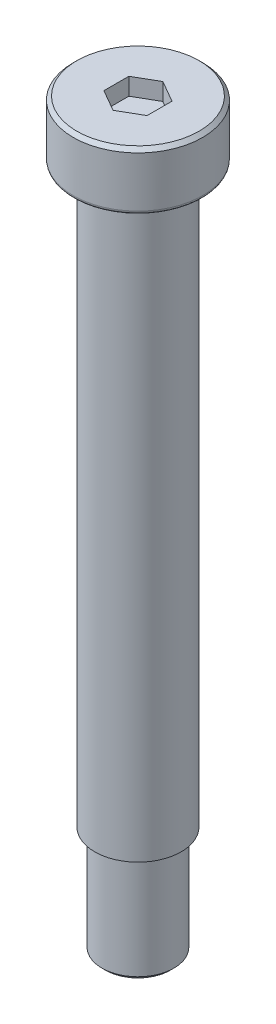
ISO-10303-21;
HEADER;
FILE_DESCRIPTION(('STEP AP214'),'2;1');
FILE_NAME('part.step','',(''),(''),'','','');
FILE_SCHEMA(('AUTOMOTIVE_DESIGN { 1 0 10303 214 1 1 1 1 }'));
ENDSEC;
DATA;
#1=APPLICATION_CONTEXT('core data for automotive mechanical design processes');
#2=APPLICATION_PROTOCOL_DEFINITION('international standard','automotive_design',2000,#1);
#3=PRODUCT_CONTEXT('',#1,'mechanical');
#4=PRODUCT('Part','Part','',(#3));
#5=PRODUCT_RELATED_PRODUCT_CATEGORY('part','',(#4));
#6=PRODUCT_DEFINITION_FORMATION('','',#4);
#7=PRODUCT_DEFINITION_CONTEXT('part definition',#1,'design');
#8=PRODUCT_DEFINITION('design','',#6,#7);
#9=PRODUCT_DEFINITION_SHAPE('','',#8);
#10=(LENGTH_UNIT() NAMED_UNIT(*) SI_UNIT(.MILLI.,.METRE.));
#11=(NAMED_UNIT(*) PLANE_ANGLE_UNIT() SI_UNIT($,.RADIAN.));
#12=(NAMED_UNIT(*) SI_UNIT($,.STERADIAN.) SOLID_ANGLE_UNIT());
#13=UNCERTAINTY_MEASURE_WITH_UNIT(LENGTH_MEASURE(1.E-05),#10,'distance_accuracy_value','');
#14=(GEOMETRIC_REPRESENTATION_CONTEXT(3) GLOBAL_UNCERTAINTY_ASSIGNED_CONTEXT((#13)) GLOBAL_UNIT_ASSIGNED_CONTEXT((#10,
#11,#12)) REPRESENTATION_CONTEXT('',''));
#15=CARTESIAN_POINT('',(0.,0.,0.));
#16=DIRECTION('',(0.,0.,1.));
#17=DIRECTION('',(1.,0.,0.));
#18=AXIS2_PLACEMENT_3D('',#15,#16,#17);
#19=CARTESIAN_POINT('',(0.,0.,0.));
#20=DIRECTION('',(0.,-1.,0.));
#21=DIRECTION('',(1.,0.,0.));
#22=AXIS2_PLACEMENT_3D('',#19,#20,#21);
#23=PLANE('',#22);
#24=CARTESIAN_POINT('',(0.,0.,0.));
#25=DIRECTION('',(0.,-1.,0.));
#26=DIRECTION('',(1.,0.,0.));
#27=AXIS2_PLACEMENT_3D('',#24,#25,#26);
#28=CIRCLE('',#27,8.49999999999999);
#29=CARTESIAN_POINT('',(8.49999999999999,0.,0.));
#30=VERTEX_POINT('',#29);
#31=EDGE_CURVE('E164',#30,#30,#28,.F.);
#32=ORIENTED_EDGE('',*,*,#31,.T.);
#33=EDGE_LOOP('',(#32));
#34=FACE_BOUND('',#33,.T.);
#35=DIRECTION('',(0.866025403784439,0.,-0.5));
#36=VECTOR('',#35,1.);
#37=CARTESIAN_POINT('',(0.,0.,3.46410161513776));
#38=LINE('',#37,#36);
#39=CARTESIAN_POINT('',(0.,0.,3.46410161513776));
#40=VERTEX_POINT('',#39);
#41=CARTESIAN_POINT('',(3.,0.,1.73205080756888));
#42=VERTEX_POINT('',#41);
#43=EDGE_CURVE('E131',#40,#42,#38,.T.);
#44=ORIENTED_EDGE('',*,*,#43,.F.);
#45=DIRECTION('',(0.866025403784439,0.,0.5));
#46=VECTOR('',#45,1.);
#47=CARTESIAN_POINT('',(-3.,0.,1.73205080756888));
#48=LINE('',#47,#46);
#49=CARTESIAN_POINT('',(-3.,0.,1.73205080756888));
#50=VERTEX_POINT('',#49);
#51=EDGE_CURVE('E57',#50,#40,#48,.T.);
#52=ORIENTED_EDGE('',*,*,#51,.F.);
#53=DIRECTION('',(0.,0.,1.));
#54=VECTOR('',#53,1.);
#55=CARTESIAN_POINT('',(-3.,0.,-1.73205080756888));
#56=LINE('',#55,#54);
#57=CARTESIAN_POINT('',(-3.,0.,-1.73205080756888));
#58=VERTEX_POINT('',#57);
#59=EDGE_CURVE('E140',#58,#50,#56,.T.);
#60=ORIENTED_EDGE('',*,*,#59,.F.);
#61=DIRECTION('',(-0.866025403784439,0.,0.5));
#62=VECTOR('',#61,1.);
#63=CARTESIAN_POINT('',(0.,0.,-3.46410161513775));
#64=LINE('',#63,#62);
#65=CARTESIAN_POINT('',(0.,0.,-3.46410161513775));
#66=VERTEX_POINT('',#65);
#67=EDGE_CURVE('E138',#66,#58,#64,.T.);
#68=ORIENTED_EDGE('',*,*,#67,.F.);
#69=DIRECTION('',(-0.866025403784439,0.,-0.5));
#70=VECTOR('',#69,1.);
#71=CARTESIAN_POINT('',(3.,0.,-1.73205080756888));
#72=LINE('',#71,#70);
#73=CARTESIAN_POINT('',(3.,0.,-1.73205080756888));
#74=VERTEX_POINT('',#73);
#75=EDGE_CURVE('E105',#74,#66,#72,.T.);
#76=ORIENTED_EDGE('',*,*,#75,.F.);
#77=DIRECTION('',(0.,0.,-1.));
#78=VECTOR('',#77,1.);
#79=CARTESIAN_POINT('',(3.,0.,1.73205080756888));
#80=LINE('',#79,#78);
#81=EDGE_CURVE('E134',#42,#74,#80,.T.);
#82=ORIENTED_EDGE('',*,*,#81,.F.);
#83=EDGE_LOOP('',(#44,#52,#60,#68,#76,#82));
#84=FACE_BOUND('',#83,.T.);
#85=ADVANCED_FACE('F41',(#34,#84),#23,.F.);
#86=CARTESIAN_POINT('',(0.,5.,0.));
#87=DIRECTION('',(0.,1.,0.));
#88=DIRECTION('',(-1.,0.,0.));
#89=AXIS2_PLACEMENT_3D('',#86,#87,#88);
#90=CYLINDRICAL_SURFACE('',#89,9.);
#91=CARTESIAN_POINT('',(0.,-7.50000000000001,0.));
#92=DIRECTION('',(0.,1.,0.));
#93=DIRECTION('',(-1.,0.,0.));
#94=AXIS2_PLACEMENT_3D('',#91,#92,#93);
#95=CIRCLE('',#94,9.);
#96=CARTESIAN_POINT('',(-9.,-7.50000000000001,0.));
#97=VERTEX_POINT('',#96);
#98=EDGE_CURVE('E170',#97,#97,#95,.T.);
#99=ORIENTED_EDGE('',*,*,#98,.T.);
#100=EDGE_LOOP('',(#99));
#101=FACE_BOUND('',#100,.T.);
#102=CARTESIAN_POINT('',(0.,-0.499999999999996,0.));
#103=DIRECTION('',(0.,-1.,0.));
#104=DIRECTION('',(1.,0.,0.));
#105=AXIS2_PLACEMENT_3D('',#102,#103,#104);
#106=CIRCLE('',#105,9.);
#107=CARTESIAN_POINT('',(9.,-0.499999999999995,0.));
#108=VERTEX_POINT('',#107);
#109=EDGE_CURVE('E167',#108,#108,#106,.T.);
#110=ORIENTED_EDGE('',*,*,#109,.T.);
#111=EDGE_LOOP('',(#110));
#112=FACE_BOUND('',#111,.T.);
#113=ADVANCED_FACE('F192',(#101,#112),#90,.T.);
#114=CARTESIAN_POINT('',(9.,-8.,0.));
#115=DIRECTION('',(0.,1.,0.));
#116=DIRECTION('',(-1.,0.,0.));
#117=AXIS2_PLACEMENT_3D('',#114,#115,#116);
#118=PLANE('',#117);
#119=CARTESIAN_POINT('',(0.,-8.00000000000001,0.));
#120=DIRECTION('',(0.,1.,0.));
#121=DIRECTION('',(-1.,0.,0.));
#122=AXIS2_PLACEMENT_3D('',#119,#120,#121);
#123=CIRCLE('',#122,8.5);
#124=CARTESIAN_POINT('',(-8.49999999999999,-8.00000000000001,0.));
#125=VERTEX_POINT('',#124);
#126=EDGE_CURVE('E173',#125,#125,#123,.F.);
#127=ORIENTED_EDGE('',*,*,#126,.T.);
#128=EDGE_LOOP('',(#127));
#129=FACE_BOUND('',#128,.T.);
#130=CARTESIAN_POINT('',(0.,-8.,0.));
#131=DIRECTION('',(0.,1.,0.));
#132=DIRECTION('',(-1.,0.,0.));
#133=AXIS2_PLACEMENT_3D('',#130,#131,#132);
#134=CIRCLE('',#133,5.75);
#135=CARTESIAN_POINT('',(-5.75,-8.,0.));
#136=VERTEX_POINT('',#135);
#137=EDGE_CURVE('E161',#136,#136,#134,.T.);
#138=ORIENTED_EDGE('',*,*,#137,.T.);
#139=EDGE_LOOP('',(#138));
#140=FACE_BOUND('',#139,.T.);
#141=ADVANCED_FACE('F200',(#129,#140),#118,.F.);
#142=CARTESIAN_POINT('',(0.,5.,0.));
#143=DIRECTION('',(0.,1.,0.));
#144=DIRECTION('',(-1.,0.,0.));
#145=AXIS2_PLACEMENT_3D('',#142,#143,#144);
#146=CYLINDRICAL_SURFACE('',#145,5.75);
#147=ORIENTED_EDGE('',*,*,#137,.F.);
#148=EDGE_LOOP('',(#147));
#149=FACE_BOUND('',#148,.T.);
#150=CARTESIAN_POINT('',(0.,-8.5,0.));
#151=DIRECTION('',(0.,1.,0.));
#152=DIRECTION('',(-1.,0.,0.));
#153=AXIS2_PLACEMENT_3D('',#150,#151,#152);
#154=CIRCLE('',#153,5.75);
#155=CARTESIAN_POINT('',(-5.75,-8.5,0.));
#156=VERTEX_POINT('',#155);
#157=EDGE_CURVE('E158',#156,#156,#154,.T.);
#158=ORIENTED_EDGE('',*,*,#157,.T.);
#159=EDGE_LOOP('',(#158));
#160=FACE_BOUND('',#159,.T.);
#161=ADVANCED_FACE('F254',(#149,#160),#146,.T.);
#162=CARTESIAN_POINT('',(5.75,-8.5,0.));
#163=DIRECTION('',(0.,-1.,0.));
#164=DIRECTION('',(1.,0.,0.));
#165=AXIS2_PLACEMENT_3D('',#162,#163,#164);
#166=PLANE('',#165);
#167=ORIENTED_EDGE('',*,*,#157,.F.);
#168=EDGE_LOOP('',(#167));
#169=FACE_BOUND('',#168,.T.);
#170=CARTESIAN_POINT('',(0.,-8.5,0.));
#171=DIRECTION('',(0.,1.,0.));
#172=DIRECTION('',(-1.,0.,0.));
#173=AXIS2_PLACEMENT_3D('',#170,#171,#172);
#174=CIRCLE('',#173,6.);
#175=CARTESIAN_POINT('',(-6.,-8.5,0.));
#176=VERTEX_POINT('',#175);
#177=EDGE_CURVE('E155',#176,#176,#174,.T.);
#178=ORIENTED_EDGE('',*,*,#177,.T.);
#179=EDGE_LOOP('',(#178));
#180=FACE_BOUND('',#179,.T.);
#181=ADVANCED_FACE('F250',(#169,#180),#166,.F.);
#182=CARTESIAN_POINT('',(0.,5.,0.));
#183=DIRECTION('',(0.,1.,0.));
#184=DIRECTION('',(-1.,0.,0.));
#185=AXIS2_PLACEMENT_3D('',#182,#183,#184);
#186=CYLINDRICAL_SURFACE('',#185,6.00000000000001);
#187=ORIENTED_EDGE('',*,*,#177,.F.);
#188=EDGE_LOOP('',(#187));
#189=FACE_BOUND('',#188,.T.);
#190=CARTESIAN_POINT('',(0.,-88.,0.));
#191=DIRECTION('',(0.,1.,0.));
#192=DIRECTION('',(-1.,0.,0.));
#193=AXIS2_PLACEMENT_3D('',#190,#191,#192);
#194=CIRCLE('',#193,6.00000000000001);
#195=CARTESIAN_POINT('',(-6.,-88.,0.));
#196=VERTEX_POINT('',#195);
#197=EDGE_CURVE('E152',#196,#196,#194,.T.);
#198=ORIENTED_EDGE('',*,*,#197,.T.);
#199=EDGE_LOOP('',(#198));
#200=FACE_BOUND('',#199,.T.);
#201=ADVANCED_FACE('F246',(#189,#200),#186,.T.);
#202=CARTESIAN_POINT('',(6.00000000000002,-88.,0.));
#203=DIRECTION('',(0.,1.,0.));
#204=DIRECTION('',(-1.,0.,0.));
#205=AXIS2_PLACEMENT_3D('',#202,#203,#204);
#206=PLANE('',#205);
#207=ORIENTED_EDGE('',*,*,#197,.F.);
#208=EDGE_LOOP('',(#207));
#209=FACE_BOUND('',#208,.T.);
#210=CARTESIAN_POINT('',(0.,-88.,0.));
#211=DIRECTION('',(0.,1.,0.));
#212=DIRECTION('',(-1.,0.,0.));
#213=AXIS2_PLACEMENT_3D('',#210,#211,#212);
#214=CIRCLE('',#213,5.);
#215=CARTESIAN_POINT('',(-4.99999999999999,-88.,0.));
#216=VERTEX_POINT('',#215);
#217=EDGE_CURVE('E144',#216,#216,#214,.T.);
#218=ORIENTED_EDGE('',*,*,#217,.T.);
#219=EDGE_LOOP('',(#218));
#220=FACE_BOUND('',#219,.T.);
#221=ADVANCED_FACE('F243',(#209,#220),#206,.F.);
#222=CARTESIAN_POINT('',(0.,5.,0.));
#223=DIRECTION('',(0.,1.,0.));
#224=DIRECTION('',(-1.,0.,0.));
#225=AXIS2_PLACEMENT_3D('',#222,#223,#224);
#226=CYLINDRICAL_SURFACE('',#225,5.);
#227=CARTESIAN_POINT('',(0.,-102.5,0.));
#228=DIRECTION('',(0.,1.,0.));
#229=DIRECTION('',(-1.,0.,0.));
#230=AXIS2_PLACEMENT_3D('',#227,#228,#229);
#231=CIRCLE('',#230,5.);
#232=CARTESIAN_POINT('',(-4.99999999999999,-102.5,0.));
#233=VERTEX_POINT('',#232);
#234=EDGE_CURVE('E50',#233,#233,#231,.T.);
#235=ORIENTED_EDGE('',*,*,#234,.T.);
#236=EDGE_LOOP('',(#235));
#237=FACE_BOUND('',#236,.T.);
#238=ORIENTED_EDGE('',*,*,#217,.F.);
#239=EDGE_LOOP('',(#238));
#240=FACE_BOUND('',#239,.T.);
#241=ADVANCED_FACE('F178',(#237,#240),#226,.T.);
#242=CARTESIAN_POINT('',(5.00000000000001,-103.,0.));
#243=DIRECTION('',(0.,1.,0.));
#244=DIRECTION('',(-1.,0.,0.));
#245=AXIS2_PLACEMENT_3D('',#242,#243,#244);
#246=PLANE('',#245);
#247=CARTESIAN_POINT('',(0.,-103.,0.));
#248=DIRECTION('',(0.,1.,0.));
#249=DIRECTION('',(-1.,0.,0.));
#250=AXIS2_PLACEMENT_3D('',#247,#248,#249);
#251=CIRCLE('',#250,4.49999999999997);
#252=CARTESIAN_POINT('',(-4.49999999999996,-103.,0.));
#253=VERTEX_POINT('',#252);
#254=EDGE_CURVE('E11',#253,#253,#251,.F.);
#255=ORIENTED_EDGE('',*,*,#254,.T.);
#256=EDGE_LOOP('',(#255));
#257=FACE_BOUND('',#256,.T.);
#258=ADVANCED_FACE('F238',(#257),#246,.F.);
#259=CARTESIAN_POINT('',(-3.,-2.4,1.73205080756888));
#260=DIRECTION('',(-0.5,0.,0.866025403784439));
#261=DIRECTION('',(0.866025403784439,0.,0.5));
#262=AXIS2_PLACEMENT_3D('',#259,#260,#261);
#263=PLANE('',#262);
#264=ORIENTED_EDGE('',*,*,#51,.T.);
#265=DIRECTION('',(0.,1.,0.));
#266=VECTOR('',#265,1.);
#267=CARTESIAN_POINT('',(0.,-2.4,3.46410161513776));
#268=LINE('',#267,#266);
#269=CARTESIAN_POINT('',(0.,-2.4,3.46410161513776));
#270=VERTEX_POINT('',#269);
#271=EDGE_CURVE('E87',#270,#40,#268,.T.);
#272=ORIENTED_EDGE('',*,*,#271,.F.);
#273=DIRECTION('',(0.866025403784439,0.,0.5));
#274=VECTOR('',#273,1.);
#275=CARTESIAN_POINT('',(-3.,-2.4,1.73205080756888));
#276=LINE('',#275,#274);
#277=CARTESIAN_POINT('',(-3.,-2.4,1.73205080756888));
#278=VERTEX_POINT('',#277);
#279=EDGE_CURVE('E142',#278,#270,#276,.T.);
#280=ORIENTED_EDGE('',*,*,#279,.F.);
#281=DIRECTION('',(0.,1.,0.));
#282=VECTOR('',#281,1.);
#283=CARTESIAN_POINT('',(-3.,-2.4,1.73205080756888));
#284=LINE('',#283,#282);
#285=EDGE_CURVE('E65',#278,#50,#284,.T.);
#286=ORIENTED_EDGE('',*,*,#285,.T.);
#287=EDGE_LOOP('',(#264,#272,#280,#286));
#288=FACE_BOUND('',#287,.T.);
#289=ADVANCED_FACE('F228',(#288),#263,.F.);
#290=CARTESIAN_POINT('',(-3.,-2.4,-1.73205080756888));
#291=DIRECTION('',(-1.,0.,0.));
#292=DIRECTION('',(0.,-1.,0.));
#293=AXIS2_PLACEMENT_3D('',#290,#291,#292);
#294=PLANE('',#293);
#295=ORIENTED_EDGE('',*,*,#59,.T.);
#296=ORIENTED_EDGE('',*,*,#285,.F.);
#297=DIRECTION('',(0.,0.,1.));
#298=VECTOR('',#297,1.);
#299=CARTESIAN_POINT('',(-3.,-2.4,-1.73205080756888));
#300=LINE('',#299,#298);
#301=CARTESIAN_POINT('',(-3.,-2.4,-1.73205080756888));
#302=VERTEX_POINT('',#301);
#303=EDGE_CURVE('E117',#302,#278,#300,.T.);
#304=ORIENTED_EDGE('',*,*,#303,.F.);
#305=DIRECTION('',(0.,1.,0.));
#306=VECTOR('',#305,1.);
#307=CARTESIAN_POINT('',(-3.,-2.4,-1.73205080756888));
#308=LINE('',#307,#306);
#309=EDGE_CURVE('E109',#302,#58,#308,.T.);
#310=ORIENTED_EDGE('',*,*,#309,.T.);
#311=EDGE_LOOP('',(#295,#296,#304,#310));
#312=FACE_BOUND('',#311,.T.);
#313=ADVANCED_FACE('F225',(#312),#294,.F.);
#314=CARTESIAN_POINT('',(0.,-2.4,-3.46410161513775));
#315=DIRECTION('',(-0.5,0.,-0.866025403784439));
#316=DIRECTION('',(-0.866025403784439,0.,0.5));
#317=AXIS2_PLACEMENT_3D('',#314,#315,#316);
#318=PLANE('',#317);
#319=ORIENTED_EDGE('',*,*,#67,.T.);
#320=ORIENTED_EDGE('',*,*,#309,.F.);
#321=DIRECTION('',(-0.866025403784439,0.,0.5));
#322=VECTOR('',#321,1.);
#323=CARTESIAN_POINT('',(0.,-2.4,-3.46410161513775));
#324=LINE('',#323,#322);
#325=CARTESIAN_POINT('',(0.,-2.4,-3.46410161513775));
#326=VERTEX_POINT('',#325);
#327=EDGE_CURVE('E113',#326,#302,#324,.T.);
#328=ORIENTED_EDGE('',*,*,#327,.F.);
#329=DIRECTION('',(0.,1.,0.));
#330=VECTOR('',#329,1.);
#331=CARTESIAN_POINT('',(0.,-2.4,-3.46410161513775));
#332=LINE('',#331,#330);
#333=EDGE_CURVE('E98',#326,#66,#332,.T.);
#334=ORIENTED_EDGE('',*,*,#333,.T.);
#335=EDGE_LOOP('',(#319,#320,#328,#334));
#336=FACE_BOUND('',#335,.T.);
#337=ADVANCED_FACE('F114',(#336),#318,.F.);
#338=CARTESIAN_POINT('',(3.,-2.4,-1.73205080756888));
#339=DIRECTION('',(0.5,0.,-0.866025403784439));
#340=DIRECTION('',(-0.866025403784439,0.,-0.5));
#341=AXIS2_PLACEMENT_3D('',#338,#339,#340);
#342=PLANE('',#341);
#343=ORIENTED_EDGE('',*,*,#75,.T.);
#344=ORIENTED_EDGE('',*,*,#333,.F.);
#345=DIRECTION('',(-0.866025403784439,0.,-0.5));
#346=VECTOR('',#345,1.);
#347=CARTESIAN_POINT('',(3.,-2.4,-1.73205080756888));
#348=LINE('',#347,#346);
#349=CARTESIAN_POINT('',(3.,-2.4,-1.73205080756888));
#350=VERTEX_POINT('',#349);
#351=EDGE_CURVE('E102',#350,#326,#348,.T.);
#352=ORIENTED_EDGE('',*,*,#351,.F.);
#353=DIRECTION('',(0.,1.,0.));
#354=VECTOR('',#353,1.);
#355=CARTESIAN_POINT('',(3.,-2.4,-1.73205080756888));
#356=LINE('',#355,#354);
#357=EDGE_CURVE('E110',#350,#74,#356,.T.);
#358=ORIENTED_EDGE('',*,*,#357,.T.);
#359=EDGE_LOOP('',(#343,#344,#352,#358));
#360=FACE_BOUND('',#359,.T.);
#361=ADVANCED_FACE('F100',(#360),#342,.F.);
#362=CARTESIAN_POINT('',(3.,-2.4,1.73205080756888));
#363=DIRECTION('',(1.,0.,0.));
#364=DIRECTION('',(0.,0.,-1.));
#365=AXIS2_PLACEMENT_3D('',#362,#363,#364);
#366=PLANE('',#365);
#367=ORIENTED_EDGE('',*,*,#81,.T.);
#368=ORIENTED_EDGE('',*,*,#357,.F.);
#369=DIRECTION('',(0.,0.,-1.));
#370=VECTOR('',#369,1.);
#371=CARTESIAN_POINT('',(3.,-2.4,1.73205080756888));
#372=LINE('',#371,#370);
#373=CARTESIAN_POINT('',(3.,-2.4,1.73205080756888));
#374=VERTEX_POINT('',#373);
#375=EDGE_CURVE('E123',#374,#350,#372,.T.);
#376=ORIENTED_EDGE('',*,*,#375,.F.);
#377=DIRECTION('',(0.,1.,0.));
#378=VECTOR('',#377,1.);
#379=CARTESIAN_POINT('',(3.,-2.4,1.73205080756888));
#380=LINE('',#379,#378);
#381=EDGE_CURVE('E147',#374,#42,#380,.T.);
#382=ORIENTED_EDGE('',*,*,#381,.T.);
#383=EDGE_LOOP('',(#367,#368,#376,#382));
#384=FACE_BOUND('',#383,.T.);
#385=ADVANCED_FACE('F221',(#384),#366,.F.);
#386=CARTESIAN_POINT('',(0.,-2.4,3.46410161513776));
#387=DIRECTION('',(0.5,0.,0.866025403784439));
#388=DIRECTION('',(0.866025403784439,0.,-0.5));
#389=AXIS2_PLACEMENT_3D('',#386,#387,#388);
#390=PLANE('',#389);
#391=ORIENTED_EDGE('',*,*,#43,.T.);
#392=ORIENTED_EDGE('',*,*,#381,.F.);
#393=DIRECTION('',(0.866025403784439,0.,-0.5));
#394=VECTOR('',#393,1.);
#395=CARTESIAN_POINT('',(0.,-2.4,3.46410161513776));
#396=LINE('',#395,#394);
#397=EDGE_CURVE('E125',#270,#374,#396,.T.);
#398=ORIENTED_EDGE('',*,*,#397,.F.);
#399=ORIENTED_EDGE('',*,*,#271,.T.);
#400=EDGE_LOOP('',(#391,#392,#398,#399));
#401=FACE_BOUND('',#400,.T.);
#402=ADVANCED_FACE('F212',(#401),#390,.F.);
#403=CARTESIAN_POINT('',(0.,-2.4,0.));
#404=DIRECTION('',(0.,1.,0.));
#405=DIRECTION('',(-1.,0.,0.));
#406=AXIS2_PLACEMENT_3D('',#403,#404,#405);
#407=PLANE('',#406);
#408=ORIENTED_EDGE('',*,*,#279,.T.);
#409=ORIENTED_EDGE('',*,*,#397,.T.);
#410=ORIENTED_EDGE('',*,*,#375,.T.);
#411=ORIENTED_EDGE('',*,*,#351,.T.);
#412=ORIENTED_EDGE('',*,*,#327,.T.);
#413=ORIENTED_EDGE('',*,*,#303,.T.);
#414=EDGE_LOOP('',(#408,#409,#410,#411,#412,#413));
#415=FACE_BOUND('',#414,.T.);
#416=ADVANCED_FACE('F120',(#415),#407,.T.);
#417=CARTESIAN_POINT('',(0.,0.,0.));
#418=DIRECTION('',(0.,-1.,0.));
#419=DIRECTION('',(1.,0.,0.));
#420=AXIS2_PLACEMENT_3D('',#417,#418,#419);
#421=CONICAL_SURFACE('',#420,8.49999999999999,0.78539816339746);
#422=ORIENTED_EDGE('',*,*,#109,.F.);
#423=EDGE_LOOP('',(#422));
#424=FACE_BOUND('',#423,.T.);
#425=ORIENTED_EDGE('',*,*,#31,.F.);
#426=EDGE_LOOP('',(#425));
#427=FACE_BOUND('',#426,.T.);
#428=ADVANCED_FACE('F188',(#424,#427),#421,.T.);
#429=CARTESIAN_POINT('',(0.,-7.50000000000001,0.));
#430=DIRECTION('',(0.,1.,0.));
#431=DIRECTION('',(-1.,0.,0.));
#432=AXIS2_PLACEMENT_3D('',#429,#430,#431);
#433=TOROIDAL_SURFACE('',#432,8.5,0.5);
#434=ORIENTED_EDGE('',*,*,#126,.F.);
#435=EDGE_LOOP('',(#434));
#436=FACE_BOUND('',#435,.T.);
#437=ORIENTED_EDGE('',*,*,#98,.F.);
#438=EDGE_LOOP('',(#437));
#439=FACE_BOUND('',#438,.T.);
#440=ADVANCED_FACE('F182',(#436,#439),#433,.T.);
#441=CARTESIAN_POINT('',(0.,-102.5,0.));
#442=DIRECTION('',(0.,1.,0.));
#443=DIRECTION('',(-1.,0.,0.));
#444=AXIS2_PLACEMENT_3D('',#441,#442,#443);
#445=CONICAL_SURFACE('',#444,5.,0.785398163397431);
#446=ORIENTED_EDGE('',*,*,#254,.F.);
#447=EDGE_LOOP('',(#446));
#448=FACE_BOUND('',#447,.T.);
#449=ORIENTED_EDGE('',*,*,#234,.F.);
#450=EDGE_LOOP('',(#449));
#451=FACE_BOUND('',#450,.T.);
#452=ADVANCED_FACE('F44',(#448,#451),#445,.T.);
#453=CLOSED_SHELL('',(#85,#113,#141,#161,#181,#201,#221,#241,#258,#289,#313,#337,#361,#385,#402,
#416,#428,#440,#452));
#454=MANIFOLD_SOLID_BREP('B2',#453);
#455=ADVANCED_BREP_SHAPE_REPRESENTATION('',(#18,#454),#14);
#456=SHAPE_DEFINITION_REPRESENTATION(#9,#455);
ENDSEC;
END-ISO-10303-21;
